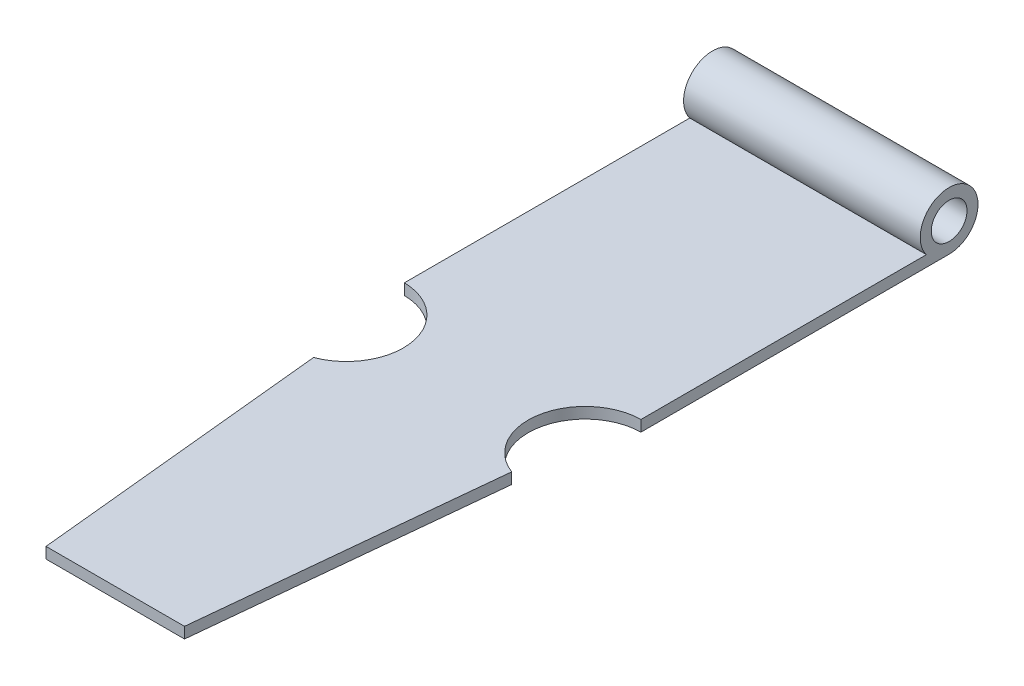
ISO-10303-21;
HEADER;
FILE_DESCRIPTION(('STEP AP214'),'2;1');
FILE_NAME('part.step','',(''),(''),'','','');
FILE_SCHEMA(('AUTOMOTIVE_DESIGN { 1 0 10303 214 1 1 1 1 }'));
ENDSEC;
DATA;
#1=APPLICATION_CONTEXT('core data for automotive mechanical design processes');
#2=APPLICATION_PROTOCOL_DEFINITION('international standard','automotive_design',2000,#1);
#3=PRODUCT_CONTEXT('',#1,'mechanical');
#4=PRODUCT('Part','Part','',(#3));
#5=PRODUCT_RELATED_PRODUCT_CATEGORY('part','',(#4));
#6=PRODUCT_DEFINITION_FORMATION('','',#4);
#7=PRODUCT_DEFINITION_CONTEXT('part definition',#1,'design');
#8=PRODUCT_DEFINITION('design','',#6,#7);
#9=PRODUCT_DEFINITION_SHAPE('','',#8);
#10=(LENGTH_UNIT() NAMED_UNIT(*) SI_UNIT(.MILLI.,.METRE.));
#11=(NAMED_UNIT(*) PLANE_ANGLE_UNIT() SI_UNIT($,.RADIAN.));
#12=(NAMED_UNIT(*) SI_UNIT($,.STERADIAN.) SOLID_ANGLE_UNIT());
#13=UNCERTAINTY_MEASURE_WITH_UNIT(LENGTH_MEASURE(1.E-05),#10,'distance_accuracy_value','');
#14=(GEOMETRIC_REPRESENTATION_CONTEXT(3) GLOBAL_UNCERTAINTY_ASSIGNED_CONTEXT((#13)) GLOBAL_UNIT_ASSIGNED_CONTEXT((#10,
#11,#12)) REPRESENTATION_CONTEXT('',''));
#15=CARTESIAN_POINT('',(0.,0.,0.));
#16=DIRECTION('',(0.,0.,1.));
#17=DIRECTION('',(1.,0.,0.));
#18=AXIS2_PLACEMENT_3D('',#15,#16,#17);
#19=CARTESIAN_POINT('',(21.6806462096804,2.,66.3134867292488));
#20=DIRECTION('',(0.,-1.,0.));
#21=DIRECTION('',(0.,0.,-1.));
#22=AXIS2_PLACEMENT_3D('',#19,#20,#21);
#23=CYLINDRICAL_SURFACE('',#22,10.3404677775561);
#24=CARTESIAN_POINT('',(21.6806462096804,0.,66.3134867292488));
#25=DIRECTION('',(0.,1.,0.));
#26=DIRECTION('',(0.,0.,1.));
#27=AXIS2_PLACEMENT_3D('',#24,#25,#26);
#28=CIRCLE('',#27,10.3404677775561);
#29=CARTESIAN_POINT('',(21.495,0.,55.9746855732391));
#30=VERTEX_POINT('',#29);
#31=CARTESIAN_POINT('',(17.9946577729683,0.,75.9746855732381));
#32=VERTEX_POINT('',#31);
#33=EDGE_CURVE('E135',#30,#32,#28,.T.);
#34=ORIENTED_EDGE('',*,*,#33,.F.);
#35=DIRECTION('',(0.,-1.,0.));
#36=VECTOR('',#35,1.);
#37=CARTESIAN_POINT('',(21.495,2.,55.9746855732391));
#38=LINE('',#37,#36);
#39=CARTESIAN_POINT('',(21.495,2.,55.9746855732391));
#40=VERTEX_POINT('',#39);
#41=EDGE_CURVE('E11',#40,#30,#38,.T.);
#42=ORIENTED_EDGE('',*,*,#41,.F.);
#43=CARTESIAN_POINT('',(21.6806462096804,2.,66.3134867292488));
#44=DIRECTION('',(0.,1.,0.));
#45=DIRECTION('',(0.,0.,1.));
#46=AXIS2_PLACEMENT_3D('',#43,#44,#45);
#47=CIRCLE('',#46,10.3404677775561);
#48=CARTESIAN_POINT('',(17.9946577729683,2.,75.9746855732381));
#49=VERTEX_POINT('',#48);
#50=EDGE_CURVE('E154',#40,#49,#47,.T.);
#51=ORIENTED_EDGE('',*,*,#50,.T.);
#52=DIRECTION('',(0.,-1.,0.));
#53=VECTOR('',#52,1.);
#54=CARTESIAN_POINT('',(17.9946577729683,2.,75.9746855732381));
#55=LINE('',#54,#53);
#56=EDGE_CURVE('E59',#49,#32,#55,.T.);
#57=ORIENTED_EDGE('',*,*,#56,.T.);
#58=EDGE_LOOP('',(#34,#42,#51,#57));
#59=FACE_BOUND('',#58,.T.);
#60=ADVANCED_FACE('F43',(#59),#23,.F.);
#61=CARTESIAN_POINT('',(21.495,2.,0.));
#62=DIRECTION('',(1.,0.,0.));
#63=DIRECTION('',(0.,0.,-1.));
#64=AXIS2_PLACEMENT_3D('',#61,#62,#63);
#65=PLANE('',#64);
#66=DIRECTION('',(0.,0.,1.));
#67=VECTOR('',#66,1.);
#68=CARTESIAN_POINT('',(21.495,0.,0.));
#69=LINE('',#68,#67);
#70=CARTESIAN_POINT('',(21.495,0.,0.));
#71=VERTEX_POINT('',#70);
#72=EDGE_CURVE('E137',#71,#30,#69,.T.);
#73=ORIENTED_EDGE('',*,*,#72,.F.);
#74=CARTESIAN_POINT('',(21.495,5.25,0.));
#75=DIRECTION('',(1.,0.,0.));
#76=DIRECTION('',(0.,0.,-1.));
#77=AXIS2_PLACEMENT_3D('',#74,#75,#76);
#78=CIRCLE('',#77,5.25);
#79=CARTESIAN_POINT('',(21.495,2.,4.12310562561766));
#80=VERTEX_POINT('',#79);
#81=EDGE_CURVE('E189',#71,#80,#78,.T.);
#82=ORIENTED_EDGE('',*,*,#81,.T.);
#83=DIRECTION('',(0.,0.,1.));
#84=VECTOR('',#83,1.);
#85=CARTESIAN_POINT('',(21.495,2.,0.));
#86=LINE('',#85,#84);
#87=EDGE_CURVE('E95',#80,#40,#86,.T.);
#88=ORIENTED_EDGE('',*,*,#87,.T.);
#89=ORIENTED_EDGE('',*,*,#41,.T.);
#90=EDGE_LOOP('',(#73,#82,#88,#89));
#91=FACE_BOUND('',#90,.T.);
#92=CARTESIAN_POINT('',(21.495,5.25,0.));
#93=DIRECTION('',(1.,0.,0.));
#94=DIRECTION('',(0.,0.,-1.));
#95=AXIS2_PLACEMENT_3D('',#92,#93,#94);
#96=CIRCLE('',#95,3.25);
#97=CARTESIAN_POINT('',(21.495,5.25,-3.25));
#98=VERTEX_POINT('',#97);
#99=EDGE_CURVE('E194',#98,#98,#96,.T.);
#100=ORIENTED_EDGE('',*,*,#99,.F.);
#101=EDGE_LOOP('',(#100));
#102=FACE_BOUND('',#101,.T.);
#103=ADVANCED_FACE('F180',(#91,#102),#65,.T.);
#104=CARTESIAN_POINT('',(-21.495,2.,0.));
#105=DIRECTION('',(1.,0.,0.));
#106=DIRECTION('',(0.,0.,-1.));
#107=AXIS2_PLACEMENT_3D('',#104,#105,#106);
#108=PLANE('',#107);
#109=CARTESIAN_POINT('',(-21.495,5.25,0.));
#110=DIRECTION('',(1.,0.,0.));
#111=DIRECTION('',(0.,0.,-1.));
#112=AXIS2_PLACEMENT_3D('',#109,#110,#111);
#113=CIRCLE('',#112,5.25);
#114=CARTESIAN_POINT('',(-21.495,2.,4.12310562561767));
#115=VERTEX_POINT('',#114);
#116=CARTESIAN_POINT('',(-21.495,0.,0.));
#117=VERTEX_POINT('',#116);
#118=EDGE_CURVE('E202',#115,#117,#113,.F.);
#119=ORIENTED_EDGE('',*,*,#118,.T.);
#120=DIRECTION('',(0.,0.,1.));
#121=VECTOR('',#120,1.);
#122=CARTESIAN_POINT('',(-21.495,0.,0.));
#123=LINE('',#122,#121);
#124=CARTESIAN_POINT('',(-21.495,0.,55.9746855732391));
#125=VERTEX_POINT('',#124);
#126=EDGE_CURVE('E144',#117,#125,#123,.T.);
#127=ORIENTED_EDGE('',*,*,#126,.T.);
#128=DIRECTION('',(0.,-1.,0.));
#129=VECTOR('',#128,1.);
#130=CARTESIAN_POINT('',(-21.495,2.,55.9746855732391));
#131=LINE('',#130,#129);
#132=CARTESIAN_POINT('',(-21.495,2.,55.9746855732391));
#133=VERTEX_POINT('',#132);
#134=EDGE_CURVE('E51',#133,#125,#131,.T.);
#135=ORIENTED_EDGE('',*,*,#134,.F.);
#136=DIRECTION('',(0.,0.,1.));
#137=VECTOR('',#136,1.);
#138=CARTESIAN_POINT('',(-21.495,2.,0.));
#139=LINE('',#138,#137);
#140=EDGE_CURVE('E196',#115,#133,#139,.T.);
#141=ORIENTED_EDGE('',*,*,#140,.F.);
#142=EDGE_LOOP('',(#119,#127,#135,#141));
#143=FACE_BOUND('',#142,.T.);
#144=CARTESIAN_POINT('',(-21.495,5.25,0.));
#145=DIRECTION('',(1.,0.,0.));
#146=DIRECTION('',(0.,0.,-1.));
#147=AXIS2_PLACEMENT_3D('',#144,#145,#146);
#148=CIRCLE('',#147,3.25);
#149=CARTESIAN_POINT('',(-21.495,5.25,-3.25));
#150=VERTEX_POINT('',#149);
#151=EDGE_CURVE('E193',#150,#150,#148,.F.);
#152=ORIENTED_EDGE('',*,*,#151,.F.);
#153=EDGE_LOOP('',(#152));
#154=FACE_BOUND('',#153,.T.);
#155=ADVANCED_FACE('F184',(#143,#154),#108,.F.);
#156=CARTESIAN_POINT('',(-21.6806462096804,2.,66.3134867292488));
#157=DIRECTION('',(0.,-1.,0.));
#158=DIRECTION('',(0.,0.,-1.));
#159=AXIS2_PLACEMENT_3D('',#156,#157,#158);
#160=CYLINDRICAL_SURFACE('',#159,10.3404677775561);
#161=CARTESIAN_POINT('',(-21.6806462096804,0.,66.3134867292488));
#162=DIRECTION('',(0.,1.,0.));
#163=DIRECTION('',(0.,0.,1.));
#164=AXIS2_PLACEMENT_3D('',#161,#162,#163);
#165=CIRCLE('',#164,10.3404677775561);
#166=CARTESIAN_POINT('',(-17.9946577729683,0.,75.9746855732381));
#167=VERTEX_POINT('',#166);
#168=EDGE_CURVE('E146',#125,#167,#165,.F.);
#169=ORIENTED_EDGE('',*,*,#168,.T.);
#170=DIRECTION('',(0.,-1.,0.));
#171=VECTOR('',#170,1.);
#172=CARTESIAN_POINT('',(-17.9946577729683,2.,75.9746855732381));
#173=LINE('',#172,#171);
#174=CARTESIAN_POINT('',(-17.9946577729683,2.,75.9746855732381));
#175=VERTEX_POINT('',#174);
#176=EDGE_CURVE('E127',#175,#167,#173,.T.);
#177=ORIENTED_EDGE('',*,*,#176,.F.);
#178=CARTESIAN_POINT('',(-21.6806462096804,2.,66.3134867292488));
#179=DIRECTION('',(0.,1.,0.));
#180=DIRECTION('',(0.,0.,1.));
#181=AXIS2_PLACEMENT_3D('',#178,#179,#180);
#182=CIRCLE('',#181,10.3404677775561);
#183=EDGE_CURVE('E115',#133,#175,#182,.F.);
#184=ORIENTED_EDGE('',*,*,#183,.F.);
#185=ORIENTED_EDGE('',*,*,#134,.T.);
#186=EDGE_LOOP('',(#169,#177,#184,#185));
#187=FACE_BOUND('',#186,.T.);
#188=ADVANCED_FACE('F161',(#187),#160,.F.);
#189=CARTESIAN_POINT('',(-25.3544949159922,2.,2.54114047152231));
#190=DIRECTION('',(0.995015053011258,0.,-0.0997248428477273));
#191=DIRECTION('',(-0.0997248428477273,0.,-0.995015053011258));
#192=AXIS2_PLACEMENT_3D('',#189,#190,#191);
#193=PLANE('',#192);
#194=DIRECTION('',(0.0997248428477273,0.,0.995015053011258));
#195=VECTOR('',#194,1.);
#196=CARTESIAN_POINT('',(-25.3544949159922,0.,2.54114047152231));
#197=LINE('',#196,#195);
#198=CARTESIAN_POINT('',(-12.58,0.,130.));
#199=VERTEX_POINT('',#198);
#200=EDGE_CURVE('E124',#167,#199,#197,.T.);
#201=ORIENTED_EDGE('',*,*,#200,.T.);
#202=DIRECTION('',(0.,-1.,0.));
#203=VECTOR('',#202,1.);
#204=CARTESIAN_POINT('',(-12.58,2.,130.));
#205=LINE('',#204,#203);
#206=CARTESIAN_POINT('',(-12.58,2.,130.));
#207=VERTEX_POINT('',#206);
#208=EDGE_CURVE('E121',#207,#199,#205,.T.);
#209=ORIENTED_EDGE('',*,*,#208,.F.);
#210=DIRECTION('',(0.0997248428477273,0.,0.995015053011258));
#211=VECTOR('',#210,1.);
#212=CARTESIAN_POINT('',(-25.3544949159922,2.,2.54114047152231));
#213=LINE('',#212,#211);
#214=EDGE_CURVE('E107',#175,#207,#213,.T.);
#215=ORIENTED_EDGE('',*,*,#214,.F.);
#216=ORIENTED_EDGE('',*,*,#176,.T.);
#217=EDGE_LOOP('',(#201,#209,#215,#216));
#218=FACE_BOUND('',#217,.T.);
#219=ADVANCED_FACE('F122',(#218),#193,.F.);
#220=CARTESIAN_POINT('',(0.,2.,130.));
#221=DIRECTION('',(0.,0.,-1.));
#222=DIRECTION('',(-1.,0.,0.));
#223=AXIS2_PLACEMENT_3D('',#220,#221,#222);
#224=PLANE('',#223);
#225=DIRECTION('',(1.,0.,0.));
#226=VECTOR('',#225,1.);
#227=CARTESIAN_POINT('',(0.,0.,130.));
#228=LINE('',#227,#226);
#229=CARTESIAN_POINT('',(12.58,0.,130.));
#230=VERTEX_POINT('',#229);
#231=EDGE_CURVE('E149',#199,#230,#228,.T.);
#232=ORIENTED_EDGE('',*,*,#231,.T.);
#233=DIRECTION('',(0.,-1.,0.));
#234=VECTOR('',#233,1.);
#235=CARTESIAN_POINT('',(12.58,2.,130.));
#236=LINE('',#235,#234);
#237=CARTESIAN_POINT('',(12.58,2.,130.));
#238=VERTEX_POINT('',#237);
#239=EDGE_CURVE('E83',#238,#230,#236,.T.);
#240=ORIENTED_EDGE('',*,*,#239,.F.);
#241=DIRECTION('',(1.,0.,0.));
#242=VECTOR('',#241,1.);
#243=CARTESIAN_POINT('',(0.,2.,130.));
#244=LINE('',#243,#242);
#245=EDGE_CURVE('E113',#207,#238,#244,.T.);
#246=ORIENTED_EDGE('',*,*,#245,.F.);
#247=ORIENTED_EDGE('',*,*,#208,.T.);
#248=EDGE_LOOP('',(#232,#240,#246,#247));
#249=FACE_BOUND('',#248,.T.);
#250=ADVANCED_FACE('F129',(#249),#224,.F.);
#251=CARTESIAN_POINT('',(25.3544949159922,2.,2.54114047152231));
#252=DIRECTION('',(0.995015053011258,0.,0.0997248428477273));
#253=DIRECTION('',(0.0997248428477273,0.,-0.995015053011258));
#254=AXIS2_PLACEMENT_3D('',#251,#252,#253);
#255=PLANE('',#254);
#256=DIRECTION('',(-0.0997248428477273,0.,0.995015053011258));
#257=VECTOR('',#256,1.);
#258=CARTESIAN_POINT('',(25.3544949159922,0.,2.54114047152231));
#259=LINE('',#258,#257);
#260=EDGE_CURVE('E151',#32,#230,#259,.T.);
#261=ORIENTED_EDGE('',*,*,#260,.F.);
#262=ORIENTED_EDGE('',*,*,#56,.F.);
#263=DIRECTION('',(-0.0997248428477273,0.,0.995015053011258));
#264=VECTOR('',#263,1.);
#265=CARTESIAN_POINT('',(25.3544949159922,2.,2.54114047152231));
#266=LINE('',#265,#264);
#267=EDGE_CURVE('E130',#49,#238,#266,.T.);
#268=ORIENTED_EDGE('',*,*,#267,.T.);
#269=ORIENTED_EDGE('',*,*,#239,.T.);
#270=EDGE_LOOP('',(#261,#262,#268,#269));
#271=FACE_BOUND('',#270,.T.);
#272=ADVANCED_FACE('F168',(#271),#255,.T.);
#273=CARTESIAN_POINT('',(0.,2.,0.));
#274=DIRECTION('',(0.,1.,0.));
#275=DIRECTION('',(0.,0.,1.));
#276=AXIS2_PLACEMENT_3D('',#273,#274,#275);
#277=PLANE('',#276);
#278=DIRECTION('',(1.,0.,0.));
#279=VECTOR('',#278,1.);
#280=CARTESIAN_POINT('',(-36.3442424049175,2.,4.12310562561767));
#281=LINE('',#280,#279);
#282=EDGE_CURVE('E138',#115,#80,#281,.T.);
#283=ORIENTED_EDGE('',*,*,#282,.F.);
#284=ORIENTED_EDGE('',*,*,#140,.T.);
#285=ORIENTED_EDGE('',*,*,#183,.T.);
#286=ORIENTED_EDGE('',*,*,#214,.T.);
#287=ORIENTED_EDGE('',*,*,#245,.T.);
#288=ORIENTED_EDGE('',*,*,#267,.F.);
#289=ORIENTED_EDGE('',*,*,#50,.F.);
#290=ORIENTED_EDGE('',*,*,#87,.F.);
#291=EDGE_LOOP('',(#283,#284,#285,#286,#287,#288,#289,#290));
#292=FACE_BOUND('',#291,.T.);
#293=ADVANCED_FACE('F110',(#292),#277,.T.);
#294=CARTESIAN_POINT('',(0.,0.,0.));
#295=DIRECTION('',(0.,1.,0.));
#296=DIRECTION('',(0.,0.,1.));
#297=AXIS2_PLACEMENT_3D('',#294,#295,#296);
#298=PLANE('',#297);
#299=ORIENTED_EDGE('',*,*,#33,.T.);
#300=ORIENTED_EDGE('',*,*,#260,.T.);
#301=ORIENTED_EDGE('',*,*,#231,.F.);
#302=ORIENTED_EDGE('',*,*,#200,.F.);
#303=ORIENTED_EDGE('',*,*,#168,.F.);
#304=ORIENTED_EDGE('',*,*,#126,.F.);
#305=DIRECTION('',(1.,0.,0.));
#306=VECTOR('',#305,1.);
#307=CARTESIAN_POINT('',(0.,0.,0.));
#308=LINE('',#307,#306);
#309=EDGE_CURVE('E141',#117,#71,#308,.T.);
#310=ORIENTED_EDGE('',*,*,#309,.T.);
#311=ORIENTED_EDGE('',*,*,#72,.T.);
#312=EDGE_LOOP('',(#299,#300,#301,#302,#303,#304,#310,#311));
#313=FACE_BOUND('',#312,.T.);
#314=ADVANCED_FACE('F166',(#313),#298,.F.);
#315=CARTESIAN_POINT('',(-36.3442424049175,5.25,0.));
#316=DIRECTION('',(1.,0.,0.));
#317=DIRECTION('',(0.,0.,-1.));
#318=AXIS2_PLACEMENT_3D('',#315,#316,#317);
#319=CYLINDRICAL_SURFACE('',#318,5.25);
#320=ORIENTED_EDGE('',*,*,#118,.F.);
#321=ORIENTED_EDGE('',*,*,#282,.T.);
#322=ORIENTED_EDGE('',*,*,#81,.F.);
#323=ORIENTED_EDGE('',*,*,#309,.F.);
#324=EDGE_LOOP('',(#320,#321,#322,#323));
#325=FACE_BOUND('',#324,.T.);
#326=ADVANCED_FACE('F211',(#325),#319,.T.);
#327=CARTESIAN_POINT('',(-36.3442424049175,5.25,0.));
#328=DIRECTION('',(1.,0.,0.));
#329=DIRECTION('',(0.,0.,-1.));
#330=AXIS2_PLACEMENT_3D('',#327,#328,#329);
#331=CYLINDRICAL_SURFACE('',#330,3.25);
#332=ORIENTED_EDGE('',*,*,#99,.T.);
#333=EDGE_LOOP('',(#332));
#334=FACE_BOUND('',#333,.T.);
#335=ORIENTED_EDGE('',*,*,#151,.T.);
#336=EDGE_LOOP('',(#335));
#337=FACE_BOUND('',#336,.T.);
#338=ADVANCED_FACE('F213',(#334,#337),#331,.F.);
#339=CLOSED_SHELL('',(#60,#103,#155,#188,#219,#250,#272,#293,#314,#326,#338));
#340=MANIFOLD_SOLID_BREP('B2',#339);
#341=ADVANCED_BREP_SHAPE_REPRESENTATION('',(#18,#340),#14);
#342=SHAPE_DEFINITION_REPRESENTATION(#9,#341);
ENDSEC;
END-ISO-10303-21;
